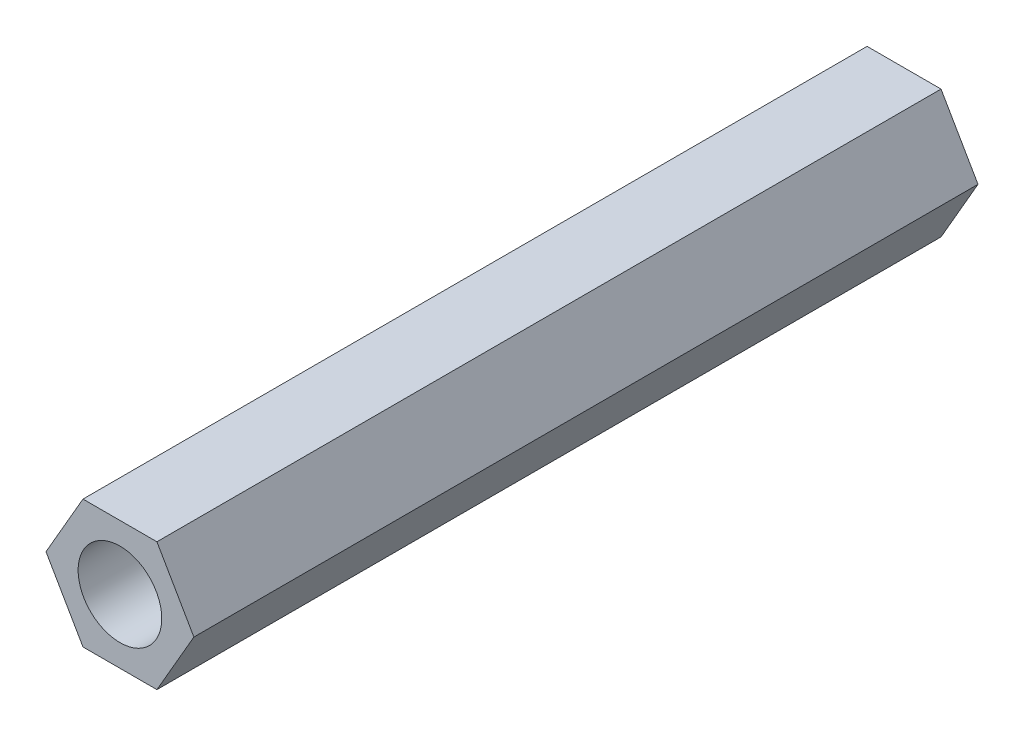
ISO-10303-21;
HEADER;
FILE_DESCRIPTION(('STEP AP214'),'2;1');
FILE_NAME('part.step','',(''),(''),'','','');
FILE_SCHEMA(('AUTOMOTIVE_DESIGN { 1 0 10303 214 1 1 1 1 }'));
ENDSEC;
DATA;
#1=APPLICATION_CONTEXT('core data for automotive mechanical design processes');
#2=APPLICATION_PROTOCOL_DEFINITION('international standard','automotive_design',2000,#1);
#3=PRODUCT_CONTEXT('',#1,'mechanical');
#4=PRODUCT('Part','Part','',(#3));
#5=PRODUCT_RELATED_PRODUCT_CATEGORY('part','',(#4));
#6=PRODUCT_DEFINITION_FORMATION('','',#4);
#7=PRODUCT_DEFINITION_CONTEXT('part definition',#1,'design');
#8=PRODUCT_DEFINITION('design','',#6,#7);
#9=PRODUCT_DEFINITION_SHAPE('','',#8);
#10=(LENGTH_UNIT() NAMED_UNIT(*) SI_UNIT(.MILLI.,.METRE.));
#11=(NAMED_UNIT(*) PLANE_ANGLE_UNIT() SI_UNIT($,.RADIAN.));
#12=(NAMED_UNIT(*) SI_UNIT($,.STERADIAN.) SOLID_ANGLE_UNIT());
#13=UNCERTAINTY_MEASURE_WITH_UNIT(LENGTH_MEASURE(1.E-05),#10,'distance_accuracy_value','');
#14=(GEOMETRIC_REPRESENTATION_CONTEXT(3) GLOBAL_UNCERTAINTY_ASSIGNED_CONTEXT((#13)) GLOBAL_UNIT_ASSIGNED_CONTEXT((#10,
#11,#12)) REPRESENTATION_CONTEXT('',''));
#15=CARTESIAN_POINT('',(0.,0.,0.));
#16=DIRECTION('',(0.,0.,1.));
#17=DIRECTION('',(1.,0.,0.));
#18=AXIS2_PLACEMENT_3D('',#15,#16,#17);
#19=CARTESIAN_POINT('',(0.,0.,30.));
#20=DIRECTION('',(0.,0.,1.));
#21=DIRECTION('',(1.,0.,0.));
#22=AXIS2_PLACEMENT_3D('',#19,#20,#21);
#23=PLANE('',#22);
#24=DIRECTION('',(0.5,0.866025403784439,0.));
#25=VECTOR('',#24,1.);
#26=CARTESIAN_POINT('',(1.41450815951458,-2.45,30.));
#27=LINE('',#26,#25);
#28=CARTESIAN_POINT('',(1.41450815951458,-2.45,30.));
#29=VERTEX_POINT('',#28);
#30=CARTESIAN_POINT('',(2.82901631902917,0.,30.));
#31=VERTEX_POINT('',#30);
#32=EDGE_CURVE('E129',#29,#31,#27,.T.);
#33=ORIENTED_EDGE('',*,*,#32,.T.);
#34=DIRECTION('',(-0.5,0.866025403784439,0.));
#35=VECTOR('',#34,1.);
#36=CARTESIAN_POINT('',(2.82901631902917,0.,30.));
#37=LINE('',#36,#35);
#38=CARTESIAN_POINT('',(1.41450815951458,2.45,30.));
#39=VERTEX_POINT('',#38);
#40=EDGE_CURVE('E87',#31,#39,#37,.T.);
#41=ORIENTED_EDGE('',*,*,#40,.T.);
#42=DIRECTION('',(-1.,0.,0.));
#43=VECTOR('',#42,1.);
#44=CARTESIAN_POINT('',(1.41450815951458,2.45,30.));
#45=LINE('',#44,#43);
#46=CARTESIAN_POINT('',(-1.41450815951458,2.45,30.));
#47=VERTEX_POINT('',#46);
#48=EDGE_CURVE('E100',#39,#47,#45,.T.);
#49=ORIENTED_EDGE('',*,*,#48,.T.);
#50=DIRECTION('',(-0.5,-0.866025403784439,0.));
#51=VECTOR('',#50,1.);
#52=CARTESIAN_POINT('',(-1.41450815951458,2.45,30.));
#53=LINE('',#52,#51);
#54=CARTESIAN_POINT('',(-2.82901631902917,0.,30.));
#55=VERTEX_POINT('',#54);
#56=EDGE_CURVE('E94',#47,#55,#53,.T.);
#57=ORIENTED_EDGE('',*,*,#56,.T.);
#58=DIRECTION('',(0.5,-0.866025403784439,0.));
#59=VECTOR('',#58,1.);
#60=CARTESIAN_POINT('',(-2.82901631902917,0.,30.));
#61=LINE('',#60,#59);
#62=CARTESIAN_POINT('',(-1.41450815951458,-2.45,30.));
#63=VERTEX_POINT('',#62);
#64=EDGE_CURVE('E98',#55,#63,#61,.T.);
#65=ORIENTED_EDGE('',*,*,#64,.T.);
#66=DIRECTION('',(1.,0.,0.));
#67=VECTOR('',#66,1.);
#68=CARTESIAN_POINT('',(-1.41450815951458,-2.45,30.));
#69=LINE('',#68,#67);
#70=EDGE_CURVE('E50',#63,#29,#69,.T.);
#71=ORIENTED_EDGE('',*,*,#70,.T.);
#72=EDGE_LOOP('',(#33,#41,#49,#57,#65,#71));
#73=FACE_BOUND('',#72,.T.);
#74=CARTESIAN_POINT('',(0.,0.,30.));
#75=DIRECTION('',(0.,0.,1.));
#76=DIRECTION('',(1.,0.,0.));
#77=AXIS2_PLACEMENT_3D('',#74,#75,#76);
#78=CIRCLE('',#77,1.6);
#79=CARTESIAN_POINT('',(1.6,0.,30.));
#80=VERTEX_POINT('',#79);
#81=EDGE_CURVE('E122',#80,#80,#78,.T.);
#82=ORIENTED_EDGE('',*,*,#81,.F.);
#83=EDGE_LOOP('',(#82));
#84=FACE_BOUND('',#83,.T.);
#85=ADVANCED_FACE('F33',(#73,#84),#23,.T.);
#86=CARTESIAN_POINT('',(0.,0.,0.));
#87=DIRECTION('',(0.,0.,1.));
#88=DIRECTION('',(1.,0.,0.));
#89=AXIS2_PLACEMENT_3D('',#86,#87,#88);
#90=PLANE('',#89);
#91=DIRECTION('',(0.5,0.866025403784439,0.));
#92=VECTOR('',#91,1.);
#93=CARTESIAN_POINT('',(1.41450815951458,-2.45,0.));
#94=LINE('',#93,#92);
#95=CARTESIAN_POINT('',(1.41450815951458,-2.45,0.));
#96=VERTEX_POINT('',#95);
#97=CARTESIAN_POINT('',(2.82901631902917,0.,0.));
#98=VERTEX_POINT('',#97);
#99=EDGE_CURVE('E118',#96,#98,#94,.T.);
#100=ORIENTED_EDGE('',*,*,#99,.F.);
#101=DIRECTION('',(1.,0.,0.));
#102=VECTOR('',#101,1.);
#103=CARTESIAN_POINT('',(-1.41450815951458,-2.45,0.));
#104=LINE('',#103,#102);
#105=CARTESIAN_POINT('',(-1.41450815951458,-2.45,0.));
#106=VERTEX_POINT('',#105);
#107=EDGE_CURVE('E79',#106,#96,#104,.T.);
#108=ORIENTED_EDGE('',*,*,#107,.F.);
#109=DIRECTION('',(0.5,-0.866025403784439,0.));
#110=VECTOR('',#109,1.);
#111=CARTESIAN_POINT('',(-2.82901631902917,0.,0.));
#112=LINE('',#111,#110);
#113=CARTESIAN_POINT('',(-2.82901631902917,0.,0.));
#114=VERTEX_POINT('',#113);
#115=EDGE_CURVE('E73',#114,#106,#112,.T.);
#116=ORIENTED_EDGE('',*,*,#115,.F.);
#117=DIRECTION('',(-0.5,-0.866025403784439,0.));
#118=VECTOR('',#117,1.);
#119=CARTESIAN_POINT('',(-1.41450815951458,2.45,0.));
#120=LINE('',#119,#118);
#121=CARTESIAN_POINT('',(-1.41450815951458,2.45,0.));
#122=VERTEX_POINT('',#121);
#123=EDGE_CURVE('E108',#122,#114,#120,.T.);
#124=ORIENTED_EDGE('',*,*,#123,.F.);
#125=DIRECTION('',(-1.,0.,0.));
#126=VECTOR('',#125,1.);
#127=CARTESIAN_POINT('',(1.41450815951458,2.45,0.));
#128=LINE('',#127,#126);
#129=CARTESIAN_POINT('',(1.41450815951458,2.45,0.));
#130=VERTEX_POINT('',#129);
#131=EDGE_CURVE('E124',#130,#122,#128,.T.);
#132=ORIENTED_EDGE('',*,*,#131,.F.);
#133=DIRECTION('',(-0.5,0.866025403784439,0.));
#134=VECTOR('',#133,1.);
#135=CARTESIAN_POINT('',(2.82901631902917,0.,0.));
#136=LINE('',#135,#134);
#137=EDGE_CURVE('E121',#98,#130,#136,.T.);
#138=ORIENTED_EDGE('',*,*,#137,.F.);
#139=EDGE_LOOP('',(#100,#108,#116,#124,#132,#138));
#140=FACE_BOUND('',#139,.T.);
#141=CARTESIAN_POINT('',(0.,0.,0.));
#142=DIRECTION('',(0.,0.,1.));
#143=DIRECTION('',(1.,0.,0.));
#144=AXIS2_PLACEMENT_3D('',#141,#142,#143);
#145=CIRCLE('',#144,1.6);
#146=CARTESIAN_POINT('',(1.6,0.,0.));
#147=VERTEX_POINT('',#146);
#148=EDGE_CURVE('E222',#147,#147,#145,.T.);
#149=ORIENTED_EDGE('',*,*,#148,.T.);
#150=EDGE_LOOP('',(#149));
#151=FACE_BOUND('',#150,.T.);
#152=ADVANCED_FACE('F138',(#140,#151),#90,.F.);
#153=CARTESIAN_POINT('',(1.41450815951458,-2.45,30.));
#154=DIRECTION('',(-0.866025403784439,0.5,0.));
#155=DIRECTION('',(-0.5,-0.866025403784439,0.));
#156=AXIS2_PLACEMENT_3D('',#153,#154,#155);
#157=PLANE('',#156);
#158=ORIENTED_EDGE('',*,*,#99,.T.);
#159=DIRECTION('',(0.,0.,-1.));
#160=VECTOR('',#159,1.);
#161=CARTESIAN_POINT('',(2.82901631902917,0.,30.));
#162=LINE('',#161,#160);
#163=EDGE_CURVE('E11',#31,#98,#162,.T.);
#164=ORIENTED_EDGE('',*,*,#163,.F.);
#165=ORIENTED_EDGE('',*,*,#32,.F.);
#166=DIRECTION('',(0.,0.,-1.));
#167=VECTOR('',#166,1.);
#168=CARTESIAN_POINT('',(1.41450815951458,-2.45,30.));
#169=LINE('',#168,#167);
#170=EDGE_CURVE('E114',#29,#96,#169,.T.);
#171=ORIENTED_EDGE('',*,*,#170,.T.);
#172=EDGE_LOOP('',(#158,#164,#165,#171));
#173=FACE_BOUND('',#172,.T.);
#174=ADVANCED_FACE('F35',(#173),#157,.F.);
#175=CARTESIAN_POINT('',(2.82901631902917,0.,30.));
#176=DIRECTION('',(-0.866025403784439,-0.5,0.));
#177=DIRECTION('',(0.5,-0.866025403784439,0.));
#178=AXIS2_PLACEMENT_3D('',#175,#176,#177);
#179=PLANE('',#178);
#180=ORIENTED_EDGE('',*,*,#137,.T.);
#181=DIRECTION('',(0.,0.,-1.));
#182=VECTOR('',#181,1.);
#183=CARTESIAN_POINT('',(1.41450815951458,2.45,30.));
#184=LINE('',#183,#182);
#185=EDGE_CURVE('E42',#39,#130,#184,.T.);
#186=ORIENTED_EDGE('',*,*,#185,.F.);
#187=ORIENTED_EDGE('',*,*,#40,.F.);
#188=ORIENTED_EDGE('',*,*,#163,.T.);
#189=EDGE_LOOP('',(#180,#186,#187,#188));
#190=FACE_BOUND('',#189,.T.);
#191=ADVANCED_FACE('F163',(#190),#179,.F.);
#192=CARTESIAN_POINT('',(1.41450815951458,2.45,30.));
#193=DIRECTION('',(0.,-1.,0.));
#194=DIRECTION('',(0.,0.,-1.));
#195=AXIS2_PLACEMENT_3D('',#192,#193,#194);
#196=PLANE('',#195);
#197=ORIENTED_EDGE('',*,*,#131,.T.);
#198=DIRECTION('',(0.,0.,-1.));
#199=VECTOR('',#198,1.);
#200=CARTESIAN_POINT('',(-1.41450815951458,2.45,30.));
#201=LINE('',#200,#199);
#202=EDGE_CURVE('E109',#47,#122,#201,.T.);
#203=ORIENTED_EDGE('',*,*,#202,.F.);
#204=ORIENTED_EDGE('',*,*,#48,.F.);
#205=ORIENTED_EDGE('',*,*,#185,.T.);
#206=EDGE_LOOP('',(#197,#203,#204,#205));
#207=FACE_BOUND('',#206,.T.);
#208=ADVANCED_FACE('F135',(#207),#196,.F.);
#209=CARTESIAN_POINT('',(-1.41450815951458,2.45,30.));
#210=DIRECTION('',(0.866025403784438,-0.5,0.));
#211=DIRECTION('',(0.5,0.866025403784439,0.));
#212=AXIS2_PLACEMENT_3D('',#209,#210,#211);
#213=PLANE('',#212);
#214=ORIENTED_EDGE('',*,*,#123,.T.);
#215=DIRECTION('',(0.,0.,-1.));
#216=VECTOR('',#215,1.);
#217=CARTESIAN_POINT('',(-2.82901631902917,0.,30.));
#218=LINE('',#217,#216);
#219=EDGE_CURVE('E105',#55,#114,#218,.T.);
#220=ORIENTED_EDGE('',*,*,#219,.F.);
#221=ORIENTED_EDGE('',*,*,#56,.F.);
#222=ORIENTED_EDGE('',*,*,#202,.T.);
#223=EDGE_LOOP('',(#214,#220,#221,#222));
#224=FACE_BOUND('',#223,.T.);
#225=ADVANCED_FACE('F106',(#224),#213,.F.);
#226=CARTESIAN_POINT('',(-2.82901631902917,0.,30.));
#227=DIRECTION('',(0.866025403784438,0.5,0.));
#228=DIRECTION('',(-0.5,0.866025403784439,0.));
#229=AXIS2_PLACEMENT_3D('',#226,#227,#228);
#230=PLANE('',#229);
#231=ORIENTED_EDGE('',*,*,#115,.T.);
#232=DIRECTION('',(0.,0.,-1.));
#233=VECTOR('',#232,1.);
#234=CARTESIAN_POINT('',(-1.41450815951458,-2.45,30.));
#235=LINE('',#234,#233);
#236=EDGE_CURVE('E110',#63,#106,#235,.T.);
#237=ORIENTED_EDGE('',*,*,#236,.F.);
#238=ORIENTED_EDGE('',*,*,#64,.F.);
#239=ORIENTED_EDGE('',*,*,#219,.T.);
#240=EDGE_LOOP('',(#231,#237,#238,#239));
#241=FACE_BOUND('',#240,.T.);
#242=ADVANCED_FACE('F112',(#241),#230,.F.);
#243=CARTESIAN_POINT('',(-1.41450815951458,-2.45,30.));
#244=DIRECTION('',(0.,1.,0.));
#245=DIRECTION('',(0.,0.,1.));
#246=AXIS2_PLACEMENT_3D('',#243,#244,#245);
#247=PLANE('',#246);
#248=ORIENTED_EDGE('',*,*,#107,.T.);
#249=ORIENTED_EDGE('',*,*,#170,.F.);
#250=ORIENTED_EDGE('',*,*,#70,.F.);
#251=ORIENTED_EDGE('',*,*,#236,.T.);
#252=EDGE_LOOP('',(#248,#249,#250,#251));
#253=FACE_BOUND('',#252,.T.);
#254=ADVANCED_FACE('F143',(#253),#247,.F.);
#255=CARTESIAN_POINT('',(0.,0.,30.));
#256=DIRECTION('',(0.,0.,-1.));
#257=DIRECTION('',(-1.,0.,0.));
#258=AXIS2_PLACEMENT_3D('',#255,#256,#257);
#259=CYLINDRICAL_SURFACE('',#258,1.6);
#260=ORIENTED_EDGE('',*,*,#81,.T.);
#261=EDGE_LOOP('',(#260));
#262=FACE_BOUND('',#261,.T.);
#263=ORIENTED_EDGE('',*,*,#148,.F.);
#264=EDGE_LOOP('',(#263));
#265=FACE_BOUND('',#264,.T.);
#266=ADVANCED_FACE('F145',(#262,#265),#259,.F.);
#267=CLOSED_SHELL('',(#85,#152,#174,#191,#208,#225,#242,#254,#266));
#268=MANIFOLD_SOLID_BREP('B2',#267);
#269=ADVANCED_BREP_SHAPE_REPRESENTATION('',(#18,#268),#14);
#270=SHAPE_DEFINITION_REPRESENTATION(#9,#269);
ENDSEC;
END-ISO-10303-21;
